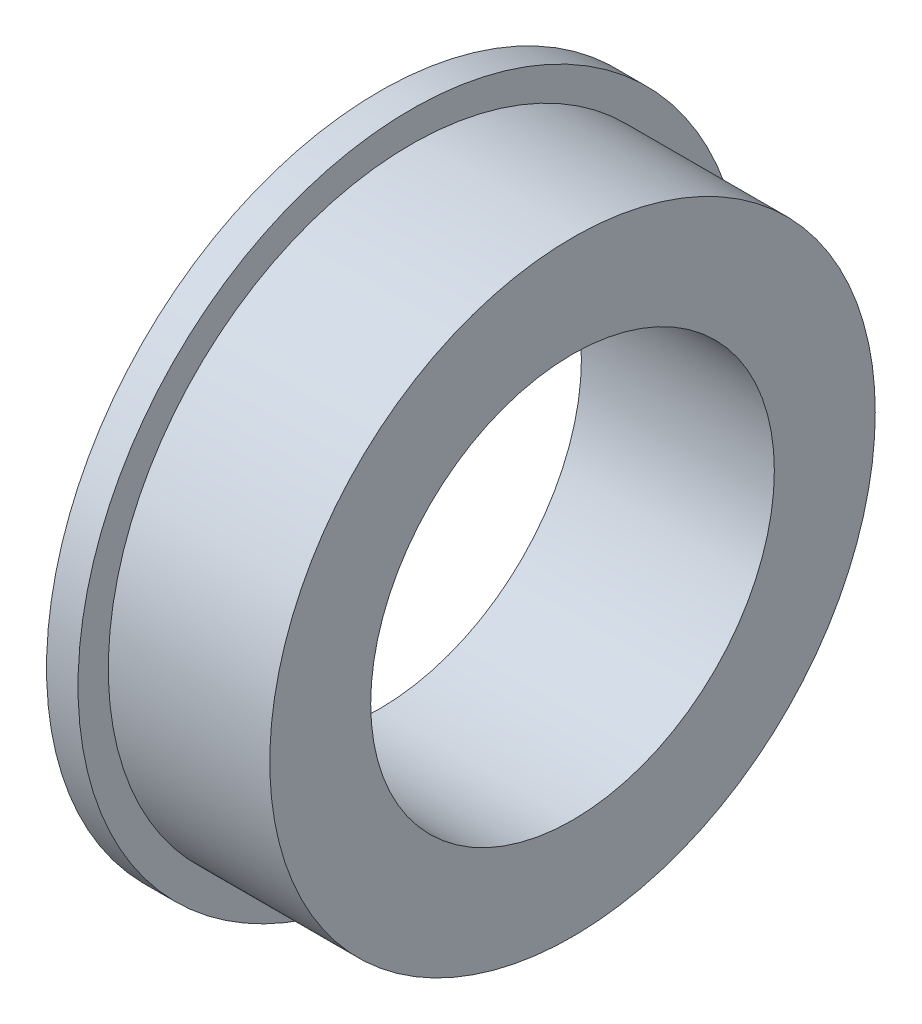
ISO-10303-21;
HEADER;
FILE_DESCRIPTION(('STEP AP214'),'2;1');
FILE_NAME('part.step','',(''),(''),'','','');
FILE_SCHEMA(('AUTOMOTIVE_DESIGN { 1 0 10303 214 1 1 1 1 }'));
ENDSEC;
DATA;
#1=APPLICATION_CONTEXT('core data for automotive mechanical design processes');
#2=APPLICATION_PROTOCOL_DEFINITION('international standard','automotive_design',2000,#1);
#3=PRODUCT_CONTEXT('',#1,'mechanical');
#4=PRODUCT('Part','Part','',(#3));
#5=PRODUCT_RELATED_PRODUCT_CATEGORY('part','',(#4));
#6=PRODUCT_DEFINITION_FORMATION('','',#4);
#7=PRODUCT_DEFINITION_CONTEXT('part definition',#1,'design');
#8=PRODUCT_DEFINITION('design','',#6,#7);
#9=PRODUCT_DEFINITION_SHAPE('','',#8);
#10=(LENGTH_UNIT() NAMED_UNIT(*) SI_UNIT(.MILLI.,.METRE.));
#11=(NAMED_UNIT(*) PLANE_ANGLE_UNIT() SI_UNIT($,.RADIAN.));
#12=(NAMED_UNIT(*) SI_UNIT($,.STERADIAN.) SOLID_ANGLE_UNIT());
#13=UNCERTAINTY_MEASURE_WITH_UNIT(LENGTH_MEASURE(1.E-05),#10,'distance_accuracy_value','');
#14=(GEOMETRIC_REPRESENTATION_CONTEXT(3) GLOBAL_UNCERTAINTY_ASSIGNED_CONTEXT((#13)) GLOBAL_UNIT_ASSIGNED_CONTEXT((#10,
#11,#12)) REPRESENTATION_CONTEXT('',''));
#15=CARTESIAN_POINT('',(0.,0.,0.));
#16=DIRECTION('',(0.,0.,1.));
#17=DIRECTION('',(1.,0.,0.));
#18=AXIS2_PLACEMENT_3D('',#15,#16,#17);
#19=CARTESIAN_POINT('',(4.,0.,0.));
#20=DIRECTION('',(1.,0.,0.));
#21=DIRECTION('',(0.,0.,-1.));
#22=AXIS2_PLACEMENT_3D('',#19,#20,#21);
#23=PLANE('',#22);
#24=CARTESIAN_POINT('',(4.,0.,0.));
#25=DIRECTION('',(1.,0.,0.));
#26=DIRECTION('',(0.,0.,-1.));
#27=AXIS2_PLACEMENT_3D('',#24,#25,#26);
#28=CIRCLE('',#27,7.5);
#29=CARTESIAN_POINT('',(4.,0.,-7.5));
#30=VERTEX_POINT('',#29);
#31=EDGE_CURVE('E10',#30,#30,#28,.T.);
#32=ORIENTED_EDGE('',*,*,#31,.T.);
#33=EDGE_LOOP('',(#32));
#34=FACE_BOUND('',#33,.T.);
#35=CARTESIAN_POINT('',(4.,0.,0.));
#36=DIRECTION('',(1.,0.,0.));
#37=DIRECTION('',(0.,0.,-1.));
#38=AXIS2_PLACEMENT_3D('',#35,#36,#37);
#39=CIRCLE('',#38,5.);
#40=CARTESIAN_POINT('',(4.,0.,-5.));
#41=VERTEX_POINT('',#40);
#42=EDGE_CURVE('E40',#41,#41,#39,.T.);
#43=ORIENTED_EDGE('',*,*,#42,.F.);
#44=EDGE_LOOP('',(#43));
#45=FACE_BOUND('',#44,.T.);
#46=ADVANCED_FACE('F32',(#34,#45),#23,.T.);
#47=CARTESIAN_POINT('',(4.,0.,0.));
#48=DIRECTION('',(-1.,0.,0.));
#49=DIRECTION('',(0.,0.,1.));
#50=AXIS2_PLACEMENT_3D('',#47,#48,#49);
#51=CYLINDRICAL_SURFACE('',#50,7.5);
#52=ORIENTED_EDGE('',*,*,#31,.F.);
#53=EDGE_LOOP('',(#52));
#54=FACE_BOUND('',#53,.T.);
#55=CARTESIAN_POINT('',(0.,0.,0.));
#56=DIRECTION('',(1.,0.,0.));
#57=DIRECTION('',(0.,0.,-1.));
#58=AXIS2_PLACEMENT_3D('',#55,#56,#57);
#59=CIRCLE('',#58,7.5);
#60=CARTESIAN_POINT('',(0.,0.,-7.5));
#61=VERTEX_POINT('',#60);
#62=EDGE_CURVE('E36',#61,#61,#59,.T.);
#63=ORIENTED_EDGE('',*,*,#62,.T.);
#64=EDGE_LOOP('',(#63));
#65=FACE_BOUND('',#64,.T.);
#66=ADVANCED_FACE('F34',(#54,#65),#51,.T.);
#67=CARTESIAN_POINT('',(4.,0.,0.));
#68=DIRECTION('',(-1.,0.,0.));
#69=DIRECTION('',(0.,0.,1.));
#70=AXIS2_PLACEMENT_3D('',#67,#68,#69);
#71=CYLINDRICAL_SURFACE('',#70,5.);
#72=ORIENTED_EDGE('',*,*,#42,.T.);
#73=EDGE_LOOP('',(#72));
#74=FACE_BOUND('',#73,.T.);
#75=CARTESIAN_POINT('',(-0.78,0.,0.));
#76=DIRECTION('',(-1.,0.,0.));
#77=DIRECTION('',(0.,0.,1.));
#78=AXIS2_PLACEMENT_3D('',#75,#76,#77);
#79=CIRCLE('',#78,5.);
#80=CARTESIAN_POINT('',(-0.78,0.,5.));
#81=VERTEX_POINT('',#80);
#82=EDGE_CURVE('E50',#81,#81,#79,.T.);
#83=ORIENTED_EDGE('',*,*,#82,.T.);
#84=EDGE_LOOP('',(#83));
#85=FACE_BOUND('',#84,.T.);
#86=ADVANCED_FACE('F56',(#74,#85),#71,.F.);
#87=CARTESIAN_POINT('',(-0.78,0.,0.));
#88=DIRECTION('',(-1.,0.,0.));
#89=DIRECTION('',(0.,0.,1.));
#90=AXIS2_PLACEMENT_3D('',#87,#88,#89);
#91=PLANE('',#90);
#92=CARTESIAN_POINT('',(-0.78,0.,0.));
#93=DIRECTION('',(-1.,0.,0.));
#94=DIRECTION('',(0.,0.,1.));
#95=AXIS2_PLACEMENT_3D('',#92,#93,#94);
#96=CIRCLE('',#95,8.25);
#97=CARTESIAN_POINT('',(-0.78,0.,-8.25));
#98=VERTEX_POINT('',#97);
#99=EDGE_CURVE('E49',#98,#98,#96,.T.);
#100=ORIENTED_EDGE('',*,*,#99,.T.);
#101=EDGE_LOOP('',(#100));
#102=FACE_BOUND('',#101,.T.);
#103=ORIENTED_EDGE('',*,*,#82,.F.);
#104=EDGE_LOOP('',(#103));
#105=FACE_BOUND('',#104,.T.);
#106=ADVANCED_FACE('F58',(#102,#105),#91,.T.);
#107=CARTESIAN_POINT('',(0.,0.,0.));
#108=DIRECTION('',(-1.,0.,0.));
#109=DIRECTION('',(0.,0.,1.));
#110=AXIS2_PLACEMENT_3D('',#107,#108,#109);
#111=PLANE('',#110);
#112=ORIENTED_EDGE('',*,*,#62,.F.);
#113=EDGE_LOOP('',(#112));
#114=FACE_BOUND('',#113,.T.);
#115=CARTESIAN_POINT('',(0.,0.,0.));
#116=DIRECTION('',(-1.,0.,0.));
#117=DIRECTION('',(0.,0.,1.));
#118=AXIS2_PLACEMENT_3D('',#115,#116,#117);
#119=CIRCLE('',#118,8.25);
#120=CARTESIAN_POINT('',(0.,0.,-8.25));
#121=VERTEX_POINT('',#120);
#122=EDGE_CURVE('E46',#121,#121,#119,.T.);
#123=ORIENTED_EDGE('',*,*,#122,.F.);
#124=EDGE_LOOP('',(#123));
#125=FACE_BOUND('',#124,.T.);
#126=ADVANCED_FACE('F60',(#114,#125),#111,.F.);
#127=CARTESIAN_POINT('',(-0.78,0.,0.));
#128=DIRECTION('',(1.,0.,0.));
#129=DIRECTION('',(0.,0.,-1.));
#130=AXIS2_PLACEMENT_3D('',#127,#128,#129);
#131=CYLINDRICAL_SURFACE('',#130,8.25);
#132=CARTESIAN_POINT('',(-0.78,0.,-8.25));
#133=CARTESIAN_POINT('',(-0.771875,0.,-8.25));
#134=CARTESIAN_POINT('',(-0.76375,0.,-8.25));
#135=CARTESIAN_POINT('',(-0.7475,0.,-8.25));
#136=CARTESIAN_POINT('',(-0.739375,0.,-8.25));
#137=CARTESIAN_POINT('',(-0.723125,0.,-8.25));
#138=CARTESIAN_POINT('',(-0.715,0.,-8.25));
#139=CARTESIAN_POINT('',(-0.69875,0.,-8.25));
#140=CARTESIAN_POINT('',(-0.690625,0.,-8.25));
#141=CARTESIAN_POINT('',(-0.674375,0.,-8.25));
#142=CARTESIAN_POINT('',(-0.66625,0.,-8.25));
#143=CARTESIAN_POINT('',(-0.65,0.,-8.25));
#144=CARTESIAN_POINT('',(-0.641875,0.,-8.25));
#145=CARTESIAN_POINT('',(-0.625625,0.,-8.25));
#146=CARTESIAN_POINT('',(-0.6175,0.,-8.25));
#147=CARTESIAN_POINT('',(-0.60125,0.,-8.25));
#148=CARTESIAN_POINT('',(-0.593125,0.,-8.25));
#149=CARTESIAN_POINT('',(-0.576875,0.,-8.25));
#150=CARTESIAN_POINT('',(-0.56875,0.,-8.25));
#151=CARTESIAN_POINT('',(-0.5525,0.,-8.25));
#152=CARTESIAN_POINT('',(-0.544375,0.,-8.25));
#153=CARTESIAN_POINT('',(-0.528125,0.,-8.25));
#154=CARTESIAN_POINT('',(-0.52,0.,-8.25));
#155=CARTESIAN_POINT('',(-0.50375,0.,-8.25));
#156=CARTESIAN_POINT('',(-0.495625,0.,-8.25));
#157=CARTESIAN_POINT('',(-0.479375,0.,-8.25));
#158=CARTESIAN_POINT('',(-0.47125,0.,-8.25));
#159=CARTESIAN_POINT('',(-0.455,0.,-8.25));
#160=CARTESIAN_POINT('',(-0.446875,0.,-8.25));
#161=CARTESIAN_POINT('',(-0.430625,0.,-8.25));
#162=CARTESIAN_POINT('',(-0.4225,0.,-8.25));
#163=CARTESIAN_POINT('',(-0.40625,0.,-8.25));
#164=CARTESIAN_POINT('',(-0.398125,0.,-8.25));
#165=CARTESIAN_POINT('',(-0.381875,0.,-8.25));
#166=CARTESIAN_POINT('',(-0.37375,0.,-8.25));
#167=CARTESIAN_POINT('',(-0.3575,0.,-8.25));
#168=CARTESIAN_POINT('',(-0.349375,0.,-8.25));
#169=CARTESIAN_POINT('',(-0.333125,0.,-8.25));
#170=CARTESIAN_POINT('',(-0.325,0.,-8.25));
#171=CARTESIAN_POINT('',(-0.30875,0.,-8.25));
#172=CARTESIAN_POINT('',(-0.300625,0.,-8.25));
#173=CARTESIAN_POINT('',(-0.284375,0.,-8.25));
#174=CARTESIAN_POINT('',(-0.27625,0.,-8.25));
#175=CARTESIAN_POINT('',(-0.26,0.,-8.25));
#176=CARTESIAN_POINT('',(-0.251875,0.,-8.25));
#177=CARTESIAN_POINT('',(-0.235625,0.,-8.25));
#178=CARTESIAN_POINT('',(-0.2275,0.,-8.25));
#179=CARTESIAN_POINT('',(-0.21125,0.,-8.25));
#180=CARTESIAN_POINT('',(-0.203125,0.,-8.25));
#181=CARTESIAN_POINT('',(-0.186875,0.,-8.25));
#182=CARTESIAN_POINT('',(-0.17875,0.,-8.25));
#183=CARTESIAN_POINT('',(-0.1625,0.,-8.25));
#184=CARTESIAN_POINT('',(-0.154375,0.,-8.25));
#185=CARTESIAN_POINT('',(-0.138125,0.,-8.25));
#186=CARTESIAN_POINT('',(-0.13,0.,-8.25));
#187=CARTESIAN_POINT('',(-0.11375,0.,-8.25));
#188=CARTESIAN_POINT('',(-0.105625,0.,-8.25));
#189=CARTESIAN_POINT('',(-0.089375,0.,-8.25));
#190=CARTESIAN_POINT('',(-0.08125,0.,-8.25));
#191=CARTESIAN_POINT('',(-0.065,0.,-8.25));
#192=CARTESIAN_POINT('',(-0.056875,0.,-8.25));
#193=CARTESIAN_POINT('',(-0.040625,0.,-8.25));
#194=CARTESIAN_POINT('',(-0.0325,0.,-8.25));
#195=CARTESIAN_POINT('',(-0.01625,0.,-8.25));
#196=CARTESIAN_POINT('',(-0.00812499999999999,0.,-8.25));
#197=CARTESIAN_POINT('',(0.,0.,-8.25));
#198=B_SPLINE_CURVE_WITH_KNOTS('',3,(#132,#133,#134,#135,#136,#137,#138,#139,#140,#141,#142,
#143,#144,#145,#146,#147,#148,#149,#150,#151,#152,#153,#154,#155,#156,#157,#158,#159,#160,#161,
#162,#163,#164,#165,#166,#167,#168,#169,#170,#171,#172,#173,#174,#175,#176,#177,#178,#179,#180,
#181,#182,#183,#184,#185,#186,#187,#188,#189,#190,#191,#192,#193,#194,#195,#196,#197),
.UNSPECIFIED.,.F.,.F.,(4,2,2,2,2,2,2,2,2,2,2,2,2,2,2,2,2,2,2,2,2,2,2,2,2,2,2,2,2,2,2,2,4),(0.,
0.0243750000000001,0.0487500000000001,0.0731250000000001,0.0975,0.121875,0.14625,0.170625,0.195,
0.219375,0.24375,0.268125,0.2925,0.316875,0.34125,0.365625,0.39,0.414375,0.43875,0.463125,
0.4875,0.511875,0.53625,0.560625,0.585,0.609375,0.63375,0.658125,0.6825,0.706875,0.73125,
0.755625,0.78),.UNSPECIFIED.);
#199=EDGE_CURVE('BSEAM67',#98,#121,#198,.T.);
#200=ORIENTED_EDGE('',*,*,#99,.F.);
#201=ORIENTED_EDGE('',*,*,#122,.T.);
#202=ORIENTED_EDGE('',*,*,#199,.T.);
#203=ORIENTED_EDGE('',*,*,#199,.F.);
#204=EDGE_LOOP('',(#200,#202,#201,#203));
#205=FACE_BOUND('',#204,.T.);
#206=ADVANCED_FACE('F67',(#205),#131,.T.);
#207=CLOSED_SHELL('',(#46,#66,#86,#106,#126,#206));
#208=MANIFOLD_SOLID_BREP('B2',#207);
#209=ADVANCED_BREP_SHAPE_REPRESENTATION('',(#18,#208),#14);
#210=SHAPE_DEFINITION_REPRESENTATION(#9,#209);
ENDSEC;
END-ISO-10303-21;
